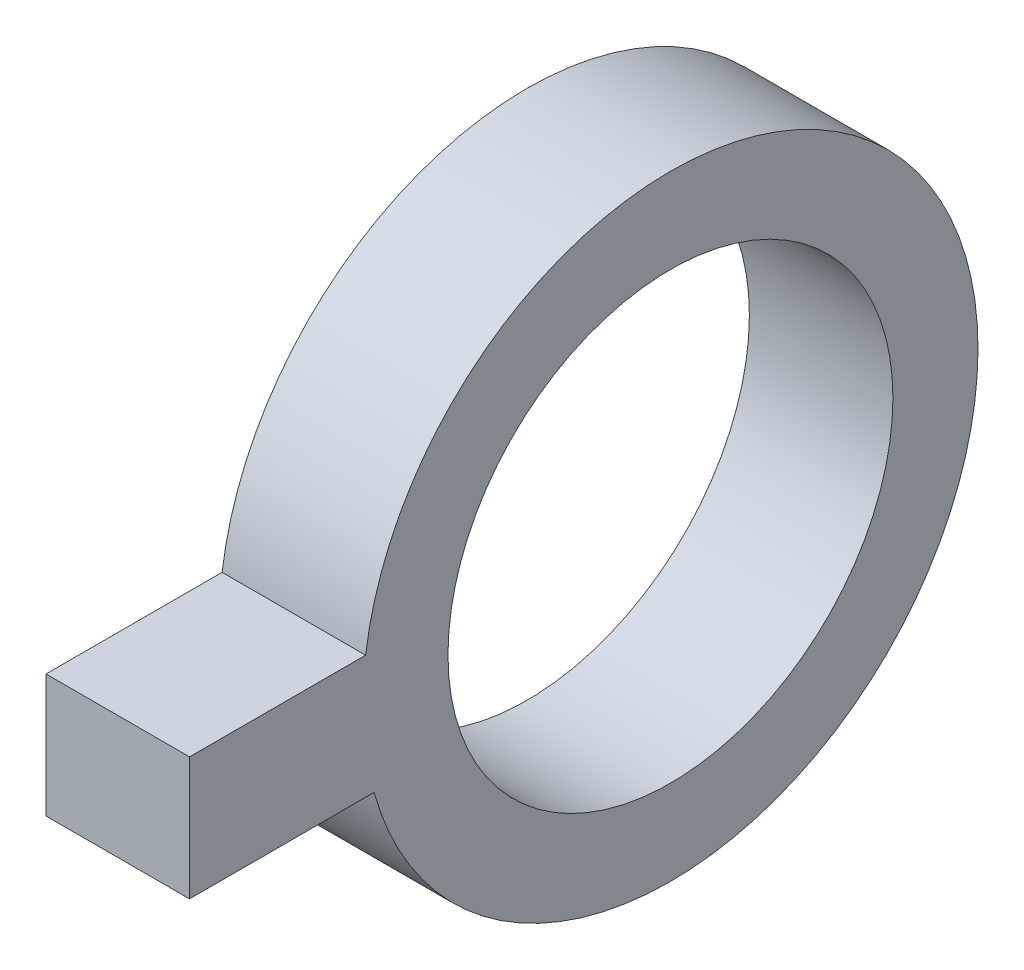
ISO-10303-21;
HEADER;
FILE_DESCRIPTION(('STEP AP214'),'2;1');
FILE_NAME('part.step','',(''),(''),'','','');
FILE_SCHEMA(('AUTOMOTIVE_DESIGN { 1 0 10303 214 1 1 1 1 }'));
ENDSEC;
DATA;
#1=APPLICATION_CONTEXT('core data for automotive mechanical design processes');
#2=APPLICATION_PROTOCOL_DEFINITION('international standard','automotive_design',2000,#1);
#3=PRODUCT_CONTEXT('',#1,'mechanical');
#4=PRODUCT('Part','Part','',(#3));
#5=PRODUCT_RELATED_PRODUCT_CATEGORY('part','',(#4));
#6=PRODUCT_DEFINITION_FORMATION('','',#4);
#7=PRODUCT_DEFINITION_CONTEXT('part definition',#1,'design');
#8=PRODUCT_DEFINITION('design','',#6,#7);
#9=PRODUCT_DEFINITION_SHAPE('','',#8);
#10=(LENGTH_UNIT() NAMED_UNIT(*) SI_UNIT(.MILLI.,.METRE.));
#11=(NAMED_UNIT(*) PLANE_ANGLE_UNIT() SI_UNIT($,.RADIAN.));
#12=(NAMED_UNIT(*) SI_UNIT($,.STERADIAN.) SOLID_ANGLE_UNIT());
#13=UNCERTAINTY_MEASURE_WITH_UNIT(LENGTH_MEASURE(1.E-05),#10,'distance_accuracy_value','');
#14=(GEOMETRIC_REPRESENTATION_CONTEXT(3) GLOBAL_UNCERTAINTY_ASSIGNED_CONTEXT((#13)) GLOBAL_UNIT_ASSIGNED_CONTEXT((#10,
#11,#12)) REPRESENTATION_CONTEXT('',''));
#15=CARTESIAN_POINT('',(0.,0.,0.));
#16=DIRECTION('',(0.,0.,1.));
#17=DIRECTION('',(1.,0.,0.));
#18=AXIS2_PLACEMENT_3D('',#15,#16,#17);
#19=CARTESIAN_POINT('',(0.,6.,0.));
#20=DIRECTION('',(0.,1.,0.));
#21=DIRECTION('',(0.,0.,1.));
#22=AXIS2_PLACEMENT_3D('',#19,#20,#21);
#23=PLANE('',#22);
#24=DIRECTION('',(0.,0.,-1.));
#25=VECTOR('',#24,1.);
#26=CARTESIAN_POINT('',(-3.5,6.,-31.));
#27=LINE('',#26,#25);
#28=CARTESIAN_POINT('',(-3.5,6.,-31.));
#29=VERTEX_POINT('',#28);
#30=CARTESIAN_POINT('',(-3.5,6.,-39.5879337324927));
#31=VERTEX_POINT('',#30);
#32=EDGE_CURVE('E80',#29,#31,#27,.T.);
#33=ORIENTED_EDGE('',*,*,#32,.F.);
#34=DIRECTION('',(-1.,0.,0.));
#35=VECTOR('',#34,1.);
#36=CARTESIAN_POINT('',(0.,6.,-31.));
#37=LINE('',#36,#35);
#38=CARTESIAN_POINT('',(3.5,6.,-31.));
#39=VERTEX_POINT('',#38);
#40=EDGE_CURVE('E90',#39,#29,#37,.T.);
#41=ORIENTED_EDGE('',*,*,#40,.F.);
#42=DIRECTION('',(0.,0.,-1.));
#43=VECTOR('',#42,1.);
#44=CARTESIAN_POINT('',(3.5,6.,-31.));
#45=LINE('',#44,#43);
#46=CARTESIAN_POINT('',(3.5,6.,-39.5879337324927));
#47=VERTEX_POINT('',#46);
#48=EDGE_CURVE('E63',#39,#47,#45,.T.);
#49=ORIENTED_EDGE('',*,*,#48,.T.);
#50=DIRECTION('',(1.,0.,0.));
#51=VECTOR('',#50,1.);
#52=CARTESIAN_POINT('',(-3.5,6.,-39.5879337324927));
#53=LINE('',#52,#51);
#54=EDGE_CURVE('E92',#31,#47,#53,.T.);
#55=ORIENTED_EDGE('',*,*,#54,.F.);
#56=EDGE_LOOP('',(#33,#41,#49,#55));
#57=FACE_BOUND('',#56,.T.);
#58=ADVANCED_FACE('F39',(#57),#23,.T.);
#59=CARTESIAN_POINT('',(0.,0.,0.));
#60=DIRECTION('',(0.,1.,0.));
#61=DIRECTION('',(0.,0.,1.));
#62=AXIS2_PLACEMENT_3D('',#59,#60,#61);
#63=PLANE('',#62);
#64=DIRECTION('',(-1.,0.,0.));
#65=VECTOR('',#64,1.);
#66=CARTESIAN_POINT('',(0.,0.,-31.));
#67=LINE('',#66,#65);
#68=CARTESIAN_POINT('',(3.5,0.,-31.));
#69=VERTEX_POINT('',#68);
#70=CARTESIAN_POINT('',(-3.5,0.,-31.));
#71=VERTEX_POINT('',#70);
#72=EDGE_CURVE('E48',#69,#71,#67,.T.);
#73=ORIENTED_EDGE('',*,*,#72,.T.);
#74=DIRECTION('',(0.,0.,-1.));
#75=VECTOR('',#74,1.);
#76=CARTESIAN_POINT('',(-3.5,0.,0.));
#77=LINE('',#76,#75);
#78=CARTESIAN_POINT('',(-3.5,0.,-40.));
#79=VERTEX_POINT('',#78);
#80=EDGE_CURVE('E55',#71,#79,#77,.T.);
#81=ORIENTED_EDGE('',*,*,#80,.T.);
#82=DIRECTION('',(-1.,0.,0.));
#83=VECTOR('',#82,1.);
#84=CARTESIAN_POINT('',(11.5470053837925,0.,-40.));
#85=LINE('',#84,#83);
#86=CARTESIAN_POINT('',(3.5,0.,-40.));
#87=VERTEX_POINT('',#86);
#88=EDGE_CURVE('E120',#87,#79,#85,.T.);
#89=ORIENTED_EDGE('',*,*,#88,.F.);
#90=DIRECTION('',(0.,0.,1.));
#91=VECTOR('',#90,1.);
#92=CARTESIAN_POINT('',(3.5,0.,0.));
#93=LINE('',#92,#91);
#94=EDGE_CURVE('E95',#87,#69,#93,.T.);
#95=ORIENTED_EDGE('',*,*,#94,.T.);
#96=EDGE_LOOP('',(#73,#81,#89,#95));
#97=FACE_BOUND('',#96,.T.);
#98=ADVANCED_FACE('F41',(#97),#63,.F.);
#99=CARTESIAN_POINT('',(-3.5,4.00688116010952,-54.4549266123616));
#100=DIRECTION('',(1.,0.,0.));
#101=DIRECTION('',(0.,0.,-1.));
#102=AXIS2_PLACEMENT_3D('',#99,#100,#101);
#103=PLANE('',#102);
#104=CARTESIAN_POINT('',(-3.5,4.00688116010952,-54.4549266123616));
#105=DIRECTION('',(1.,0.,0.));
#106=DIRECTION('',(0.,0.,-1.));
#107=AXIS2_PLACEMENT_3D('',#104,#105,#106);
#108=CIRCLE('',#107,10.85);
#109=CARTESIAN_POINT('',(-3.5,4.00688116010952,-65.3049266123616));
#110=VERTEX_POINT('',#109);
#111=EDGE_CURVE('E104',#110,#110,#108,.T.);
#112=ORIENTED_EDGE('',*,*,#111,.T.);
#113=EDGE_LOOP('',(#112));
#114=FACE_BOUND('',#113,.T.);
#115=CARTESIAN_POINT('',(-3.5,4.00688116010952,-54.4549266123616));
#116=DIRECTION('',(1.,0.,0.));
#117=DIRECTION('',(0.,0.,-1.));
#118=AXIS2_PLACEMENT_3D('',#115,#116,#117);
#119=CIRCLE('',#118,15.);
#120=EDGE_CURVE('E115',#79,#31,#119,.T.);
#121=ORIENTED_EDGE('',*,*,#120,.F.);
#122=ORIENTED_EDGE('',*,*,#80,.F.);
#123=DIRECTION('',(0.,-1.,0.));
#124=VECTOR('',#123,1.);
#125=CARTESIAN_POINT('',(-3.5,6.,-31.));
#126=LINE('',#125,#124);
#127=EDGE_CURVE('E77',#29,#71,#126,.T.);
#128=ORIENTED_EDGE('',*,*,#127,.F.);
#129=ORIENTED_EDGE('',*,*,#32,.T.);
#130=EDGE_LOOP('',(#121,#122,#128,#129));
#131=FACE_BOUND('',#130,.T.);
#132=ADVANCED_FACE('F79',(#114,#131),#103,.F.);
#133=CARTESIAN_POINT('',(3.5,4.00688116010952,-54.4549266123616));
#134=DIRECTION('',(1.,0.,0.));
#135=DIRECTION('',(0.,0.,-1.));
#136=AXIS2_PLACEMENT_3D('',#133,#134,#135);
#137=PLANE('',#136);
#138=CARTESIAN_POINT('',(3.5,4.00688116010952,-54.4549266123616));
#139=DIRECTION('',(1.,0.,0.));
#140=DIRECTION('',(0.,0.,-1.));
#141=AXIS2_PLACEMENT_3D('',#138,#139,#140);
#142=CIRCLE('',#141,10.85);
#143=CARTESIAN_POINT('',(3.5,4.00688116010952,-65.3049266123616));
#144=VERTEX_POINT('',#143);
#145=EDGE_CURVE('E99',#144,#144,#142,.T.);
#146=ORIENTED_EDGE('',*,*,#145,.F.);
#147=EDGE_LOOP('',(#146));
#148=FACE_BOUND('',#147,.T.);
#149=CARTESIAN_POINT('',(3.5,4.00688116010952,-54.4549266123616));
#150=DIRECTION('',(1.,0.,0.));
#151=DIRECTION('',(0.,0.,-1.));
#152=AXIS2_PLACEMENT_3D('',#149,#150,#151);
#153=CIRCLE('',#152,15.);
#154=EDGE_CURVE('E112',#87,#47,#153,.T.);
#155=ORIENTED_EDGE('',*,*,#154,.T.);
#156=ORIENTED_EDGE('',*,*,#48,.F.);
#157=DIRECTION('',(0.,1.,0.));
#158=VECTOR('',#157,1.);
#159=CARTESIAN_POINT('',(3.5,31.2162450184826,-31.));
#160=LINE('',#159,#158);
#161=EDGE_CURVE('E11',#69,#39,#160,.T.);
#162=ORIENTED_EDGE('',*,*,#161,.F.);
#163=ORIENTED_EDGE('',*,*,#94,.F.);
#164=EDGE_LOOP('',(#155,#156,#162,#163));
#165=FACE_BOUND('',#164,.T.);
#166=ADVANCED_FACE('F133',(#148,#165),#137,.T.);
#167=CARTESIAN_POINT('',(-3.5,4.00688116010952,-54.4549266123616));
#168=DIRECTION('',(1.,0.,0.));
#169=DIRECTION('',(0.,0.,-1.));
#170=AXIS2_PLACEMENT_3D('',#167,#168,#169);
#171=CYLINDRICAL_SURFACE('',#170,15.);
#172=ORIENTED_EDGE('',*,*,#120,.T.);
#173=ORIENTED_EDGE('',*,*,#54,.T.);
#174=ORIENTED_EDGE('',*,*,#154,.F.);
#175=ORIENTED_EDGE('',*,*,#88,.T.);
#176=EDGE_LOOP('',(#172,#173,#174,#175));
#177=FACE_BOUND('',#176,.T.);
#178=ADVANCED_FACE('F132',(#177),#171,.T.);
#179=CARTESIAN_POINT('',(-16.,4.00688116010952,-54.4549266123616));
#180=DIRECTION('',(1.,0.,0.));
#181=DIRECTION('',(0.,0.,-1.));
#182=AXIS2_PLACEMENT_3D('',#179,#180,#181);
#183=CYLINDRICAL_SURFACE('',#182,10.85);
#184=ORIENTED_EDGE('',*,*,#145,.T.);
#185=EDGE_LOOP('',(#184));
#186=FACE_BOUND('',#185,.T.);
#187=ORIENTED_EDGE('',*,*,#111,.F.);
#188=EDGE_LOOP('',(#187));
#189=FACE_BOUND('',#188,.T.);
#190=ADVANCED_FACE('F141',(#186,#189),#183,.F.);
#191=CARTESIAN_POINT('',(-61.8997308642889,31.2162450184826,-31.));
#192=DIRECTION('',(0.,0.,-1.));
#193=DIRECTION('',(0.,1.,0.));
#194=AXIS2_PLACEMENT_3D('',#191,#192,#193);
#195=PLANE('',#194);
#196=ORIENTED_EDGE('',*,*,#40,.T.);
#197=ORIENTED_EDGE('',*,*,#127,.T.);
#198=ORIENTED_EDGE('',*,*,#72,.F.);
#199=ORIENTED_EDGE('',*,*,#161,.T.);
#200=EDGE_LOOP('',(#196,#197,#198,#199));
#201=FACE_BOUND('',#200,.T.);
#202=ADVANCED_FACE('F97',(#201),#195,.F.);
#203=CLOSED_SHELL('',(#58,#98,#132,#166,#178,#190,#202));
#204=MANIFOLD_SOLID_BREP('B2',#203);
#205=ADVANCED_BREP_SHAPE_REPRESENTATION('',(#18,#204),#14);
#206=SHAPE_DEFINITION_REPRESENTATION(#9,#205);
ENDSEC;
END-ISO-10303-21;
